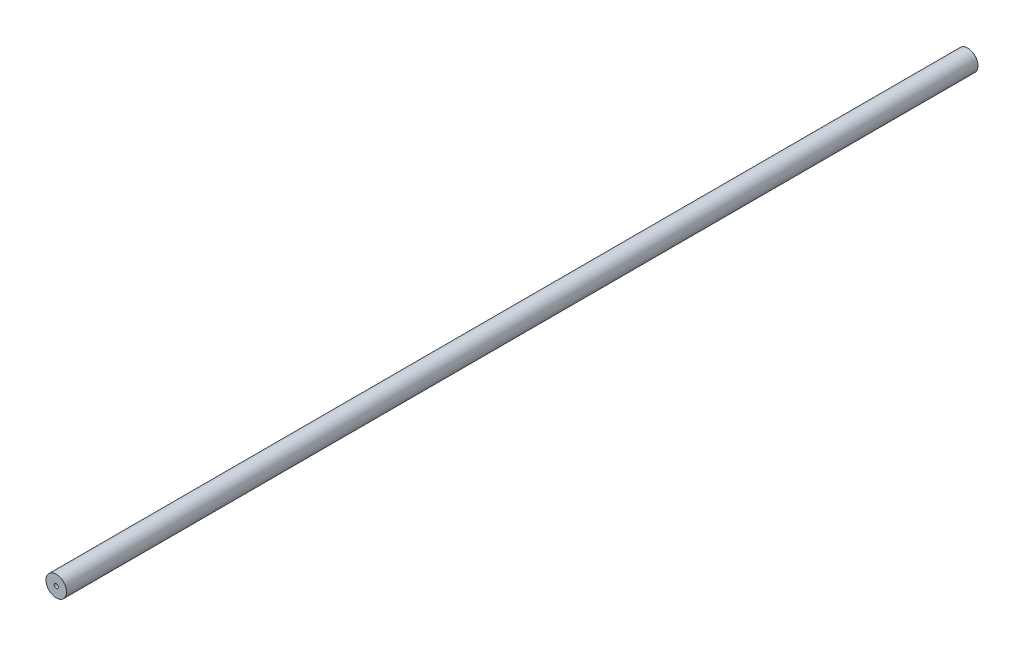
ISO-10303-21;
HEADER;
FILE_DESCRIPTION(('STEP AP214'),'2;1');
FILE_NAME('part.step','',(''),(''),'','','');
FILE_SCHEMA(('AUTOMOTIVE_DESIGN { 1 0 10303 214 1 1 1 1 }'));
ENDSEC;
DATA;
#1=APPLICATION_CONTEXT('core data for automotive mechanical design processes');
#2=APPLICATION_PROTOCOL_DEFINITION('international standard','automotive_design',2000,#1);
#3=PRODUCT_CONTEXT('',#1,'mechanical');
#4=PRODUCT('Part','Part','',(#3));
#5=PRODUCT_RELATED_PRODUCT_CATEGORY('part','',(#4));
#6=PRODUCT_DEFINITION_FORMATION('','',#4);
#7=PRODUCT_DEFINITION_CONTEXT('part definition',#1,'design');
#8=PRODUCT_DEFINITION('design','',#6,#7);
#9=PRODUCT_DEFINITION_SHAPE('','',#8);
#10=(LENGTH_UNIT() NAMED_UNIT(*) SI_UNIT(.MILLI.,.METRE.));
#11=(NAMED_UNIT(*) PLANE_ANGLE_UNIT() SI_UNIT($,.RADIAN.));
#12=(NAMED_UNIT(*) SI_UNIT($,.STERADIAN.) SOLID_ANGLE_UNIT());
#13=UNCERTAINTY_MEASURE_WITH_UNIT(LENGTH_MEASURE(1.E-05),#10,'distance_accuracy_value','');
#14=(GEOMETRIC_REPRESENTATION_CONTEXT(3) GLOBAL_UNCERTAINTY_ASSIGNED_CONTEXT((#13)) GLOBAL_UNIT_ASSIGNED_CONTEXT((#10,
#11,#12)) REPRESENTATION_CONTEXT('',''));
#15=CARTESIAN_POINT('',(0.,0.,0.));
#16=DIRECTION('',(0.,0.,1.));
#17=DIRECTION('',(1.,0.,0.));
#18=AXIS2_PLACEMENT_3D('',#15,#16,#17);
#19=CARTESIAN_POINT('',(0.,0.,247.65));
#20=DIRECTION('',(0.,0.,-1.));
#21=DIRECTION('',(-1.,0.,0.));
#22=AXIS2_PLACEMENT_3D('',#19,#20,#21);
#23=CYLINDRICAL_SURFACE('',#22,5.588);
#24=CARTESIAN_POINT('',(0.,0.,247.65));
#25=DIRECTION('',(0.,0.,1.));
#26=DIRECTION('',(1.,0.,0.));
#27=AXIS2_PLACEMENT_3D('',#24,#25,#26);
#28=CIRCLE('',#27,5.588);
#29=CARTESIAN_POINT('',(5.588,0.,247.65));
#30=VERTEX_POINT('',#29);
#31=EDGE_CURVE('E10',#30,#30,#28,.T.);
#32=ORIENTED_EDGE('',*,*,#31,.F.);
#33=EDGE_LOOP('',(#32));
#34=FACE_BOUND('',#33,.T.);
#35=CARTESIAN_POINT('',(0.,0.,-247.65));
#36=DIRECTION('',(0.,0.,1.));
#37=DIRECTION('',(1.,0.,0.));
#38=AXIS2_PLACEMENT_3D('',#35,#36,#37);
#39=CIRCLE('',#38,5.588);
#40=CARTESIAN_POINT('',(5.588,0.,-247.65));
#41=VERTEX_POINT('',#40);
#42=EDGE_CURVE('E42',#41,#41,#39,.T.);
#43=ORIENTED_EDGE('',*,*,#42,.T.);
#44=EDGE_LOOP('',(#43));
#45=FACE_BOUND('',#44,.T.);
#46=ADVANCED_FACE('F39',(#34,#45),#23,.T.);
#47=CARTESIAN_POINT('',(0.,0.,247.65));
#48=DIRECTION('',(0.,0.,1.));
#49=DIRECTION('',(1.,0.,0.));
#50=AXIS2_PLACEMENT_3D('',#47,#48,#49);
#51=PLANE('',#50);
#52=CARTESIAN_POINT('',(0.,0.,247.65));
#53=DIRECTION('',(0.,0.,1.));
#54=DIRECTION('',(1.,0.,0.));
#55=AXIS2_PLACEMENT_3D('',#52,#53,#54);
#56=CIRCLE('',#55,1.143);
#57=CARTESIAN_POINT('',(1.143,0.,247.65));
#58=VERTEX_POINT('',#57);
#59=EDGE_CURVE('E53',#58,#58,#56,.T.);
#60=ORIENTED_EDGE('',*,*,#59,.F.);
#61=EDGE_LOOP('',(#60));
#62=FACE_BOUND('',#61,.T.);
#63=ORIENTED_EDGE('',*,*,#31,.T.);
#64=EDGE_LOOP('',(#63));
#65=FACE_BOUND('',#64,.T.);
#66=ADVANCED_FACE('F82',(#62,#65),#51,.T.);
#67=CARTESIAN_POINT('',(0.,0.,-247.65));
#68=DIRECTION('',(0.,0.,1.));
#69=DIRECTION('',(1.,0.,0.));
#70=AXIS2_PLACEMENT_3D('',#67,#68,#69);
#71=PLANE('',#70);
#72=CARTESIAN_POINT('',(0.,0.,-247.65));
#73=DIRECTION('',(0.,0.,-1.));
#74=DIRECTION('',(-1.,0.,0.));
#75=AXIS2_PLACEMENT_3D('',#72,#73,#74);
#76=CIRCLE('',#75,1.143);
#77=CARTESIAN_POINT('',(-1.143,0.,-247.65));
#78=VERTEX_POINT('',#77);
#79=EDGE_CURVE('E61',#78,#78,#76,.T.);
#80=ORIENTED_EDGE('',*,*,#79,.F.);
#81=EDGE_LOOP('',(#80));
#82=FACE_BOUND('',#81,.T.);
#83=ORIENTED_EDGE('',*,*,#42,.F.);
#84=EDGE_LOOP('',(#83));
#85=FACE_BOUND('',#84,.T.);
#86=ADVANCED_FACE('F78',(#82,#85),#71,.F.);
#87=CARTESIAN_POINT('',(0.,0.,222.25));
#88=DIRECTION('',(0.,0.,1.));
#89=DIRECTION('',(1.,0.,0.));
#90=AXIS2_PLACEMENT_3D('',#87,#88,#89);
#91=CYLINDRICAL_SURFACE('',#90,1.143);
#92=CARTESIAN_POINT('',(0.,0.,222.25));
#93=DIRECTION('',(0.,0.,1.));
#94=DIRECTION('',(1.,0.,0.));
#95=AXIS2_PLACEMENT_3D('',#92,#93,#94);
#96=CIRCLE('',#95,1.143);
#97=CARTESIAN_POINT('',(1.143,0.,222.25));
#98=VERTEX_POINT('',#97);
#99=EDGE_CURVE('E51',#98,#98,#96,.T.);
#100=ORIENTED_EDGE('',*,*,#99,.F.);
#101=EDGE_LOOP('',(#100));
#102=FACE_BOUND('',#101,.T.);
#103=ORIENTED_EDGE('',*,*,#59,.T.);
#104=EDGE_LOOP('',(#103));
#105=FACE_BOUND('',#104,.T.);
#106=ADVANCED_FACE('F81',(#102,#105),#91,.F.);
#107=CARTESIAN_POINT('',(0.,0.,222.25));
#108=DIRECTION('',(0.,0.,1.));
#109=DIRECTION('',(1.,0.,0.));
#110=AXIS2_PLACEMENT_3D('',#107,#108,#109);
#111=PLANE('',#110);
#112=ORIENTED_EDGE('',*,*,#99,.T.);
#113=EDGE_LOOP('',(#112));
#114=FACE_BOUND('',#113,.T.);
#115=ADVANCED_FACE('F74',(#114),#111,.T.);
#116=CARTESIAN_POINT('',(0.,0.,-222.25));
#117=DIRECTION('',(0.,0.,-1.));
#118=DIRECTION('',(-1.,0.,0.));
#119=AXIS2_PLACEMENT_3D('',#116,#117,#118);
#120=CYLINDRICAL_SURFACE('',#119,1.143);
#121=CARTESIAN_POINT('',(0.,0.,-222.25));
#122=DIRECTION('',(0.,0.,-1.));
#123=DIRECTION('',(-1.,0.,0.));
#124=AXIS2_PLACEMENT_3D('',#121,#122,#123);
#125=CIRCLE('',#124,1.143);
#126=CARTESIAN_POINT('',(-1.143,0.,-222.25));
#127=VERTEX_POINT('',#126);
#128=EDGE_CURVE('E57',#127,#127,#125,.T.);
#129=ORIENTED_EDGE('',*,*,#128,.F.);
#130=EDGE_LOOP('',(#129));
#131=FACE_BOUND('',#130,.T.);
#132=ORIENTED_EDGE('',*,*,#79,.T.);
#133=EDGE_LOOP('',(#132));
#134=FACE_BOUND('',#133,.T.);
#135=ADVANCED_FACE('F71',(#131,#134),#120,.F.);
#136=CARTESIAN_POINT('',(0.,0.,-222.25));
#137=DIRECTION('',(0.,0.,-1.));
#138=DIRECTION('',(-1.,0.,0.));
#139=AXIS2_PLACEMENT_3D('',#136,#137,#138);
#140=PLANE('',#139);
#141=ORIENTED_EDGE('',*,*,#128,.T.);
#142=EDGE_LOOP('',(#141));
#143=FACE_BOUND('',#142,.T.);
#144=ADVANCED_FACE('F69',(#143),#140,.T.);
#145=CLOSED_SHELL('',(#46,#66,#86,#106,#115,#135,#144));
#146=MANIFOLD_SOLID_BREP('B2',#145);
#147=ADVANCED_BREP_SHAPE_REPRESENTATION('',(#18,#146),#14);
#148=SHAPE_DEFINITION_REPRESENTATION(#9,#147);
ENDSEC;
END-ISO-10303-21;
